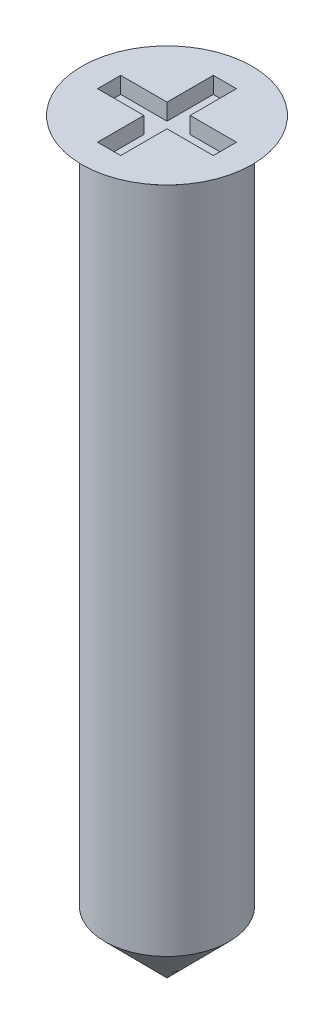
ISO-10303-21;
HEADER;
FILE_DESCRIPTION(('STEP AP214'),'2;1');
FILE_NAME('part.step','',(''),(''),'','','');
FILE_SCHEMA(('AUTOMOTIVE_DESIGN { 1 0 10303 214 1 1 1 1 }'));
ENDSEC;
DATA;
#1=APPLICATION_CONTEXT('core data for automotive mechanical design processes');
#2=APPLICATION_PROTOCOL_DEFINITION('international standard','automotive_design',2000,#1);
#3=PRODUCT_CONTEXT('',#1,'mechanical');
#4=PRODUCT('Part','Part','',(#3));
#5=PRODUCT_RELATED_PRODUCT_CATEGORY('part','',(#4));
#6=PRODUCT_DEFINITION_FORMATION('','',#4);
#7=PRODUCT_DEFINITION_CONTEXT('part definition',#1,'design');
#8=PRODUCT_DEFINITION('design','',#6,#7);
#9=PRODUCT_DEFINITION_SHAPE('','',#8);
#10=(LENGTH_UNIT() NAMED_UNIT(*) SI_UNIT(.MILLI.,.METRE.));
#11=(NAMED_UNIT(*) PLANE_ANGLE_UNIT() SI_UNIT($,.RADIAN.));
#12=(NAMED_UNIT(*) SI_UNIT($,.STERADIAN.) SOLID_ANGLE_UNIT());
#13=UNCERTAINTY_MEASURE_WITH_UNIT(LENGTH_MEASURE(1.E-05),#10,'distance_accuracy_value','');
#14=(GEOMETRIC_REPRESENTATION_CONTEXT(3) GLOBAL_UNCERTAINTY_ASSIGNED_CONTEXT((#13)) GLOBAL_UNIT_ASSIGNED_CONTEXT((#10,
#11,#12)) REPRESENTATION_CONTEXT('',''));
#15=CARTESIAN_POINT('',(0.,0.,0.));
#16=DIRECTION('',(0.,0.,1.));
#17=DIRECTION('',(1.,0.,0.));
#18=AXIS2_PLACEMENT_3D('',#15,#16,#17);
#19=CARTESIAN_POINT('',(1.03,9.03,0.));
#20=DIRECTION('',(0.,-1.,0.));
#21=DIRECTION('',(0.,0.,-1.));
#22=AXIS2_PLACEMENT_3D('',#19,#20,#21);
#23=PLANE('',#22);
#24=DIRECTION('',(0.,0.,1.));
#25=VECTOR('',#24,1.);
#26=CARTESIAN_POINT('',(-0.14,9.03,-0.14));
#27=LINE('',#26,#25);
#28=CARTESIAN_POINT('',(-0.14,9.03,-0.7));
#29=VERTEX_POINT('',#28);
#30=CARTESIAN_POINT('',(-0.14,9.03,-0.14));
#31=VERTEX_POINT('',#30);
#32=EDGE_CURVE('E196',#29,#31,#27,.T.);
#33=ORIENTED_EDGE('',*,*,#32,.F.);
#34=DIRECTION('',(-1.,0.,0.));
#35=VECTOR('',#34,1.);
#36=CARTESIAN_POINT('',(0.14,9.03,-0.7));
#37=LINE('',#36,#35);
#38=CARTESIAN_POINT('',(0.14,9.03,-0.7));
#39=VERTEX_POINT('',#38);
#40=EDGE_CURVE('E54',#39,#29,#37,.T.);
#41=ORIENTED_EDGE('',*,*,#40,.F.);
#42=DIRECTION('',(0.,0.,-1.));
#43=VECTOR('',#42,1.);
#44=CARTESIAN_POINT('',(0.14,9.03,-0.14));
#45=LINE('',#44,#43);
#46=CARTESIAN_POINT('',(0.14,9.03,-0.14));
#47=VERTEX_POINT('',#46);
#48=EDGE_CURVE('E152',#47,#39,#45,.T.);
#49=ORIENTED_EDGE('',*,*,#48,.F.);
#50=DIRECTION('',(-1.,0.,0.));
#51=VECTOR('',#50,1.);
#52=CARTESIAN_POINT('',(0.7,9.03,-0.14));
#53=LINE('',#52,#51);
#54=CARTESIAN_POINT('',(0.7,9.03,-0.14));
#55=VERTEX_POINT('',#54);
#56=EDGE_CURVE('E156',#55,#47,#53,.T.);
#57=ORIENTED_EDGE('',*,*,#56,.F.);
#58=DIRECTION('',(0.,0.,-1.));
#59=VECTOR('',#58,1.);
#60=CARTESIAN_POINT('',(0.7,9.03,0.14));
#61=LINE('',#60,#59);
#62=CARTESIAN_POINT('',(0.7,9.03,0.14));
#63=VERTEX_POINT('',#62);
#64=EDGE_CURVE('E227',#63,#55,#61,.T.);
#65=ORIENTED_EDGE('',*,*,#64,.F.);
#66=DIRECTION('',(1.,0.,0.));
#67=VECTOR('',#66,1.);
#68=CARTESIAN_POINT('',(0.7,9.03,0.14));
#69=LINE('',#68,#67);
#70=CARTESIAN_POINT('',(0.14,9.03,0.14));
#71=VERTEX_POINT('',#70);
#72=EDGE_CURVE('E223',#71,#63,#69,.T.);
#73=ORIENTED_EDGE('',*,*,#72,.F.);
#74=DIRECTION('',(0.,0.,-1.));
#75=VECTOR('',#74,1.);
#76=CARTESIAN_POINT('',(0.14,9.03,0.7));
#77=LINE('',#76,#75);
#78=CARTESIAN_POINT('',(0.14,9.03,0.7));
#79=VERTEX_POINT('',#78);
#80=EDGE_CURVE('E219',#79,#71,#77,.T.);
#81=ORIENTED_EDGE('',*,*,#80,.F.);
#82=DIRECTION('',(1.,0.,0.));
#83=VECTOR('',#82,1.);
#84=CARTESIAN_POINT('',(0.14,9.03,0.7));
#85=LINE('',#84,#83);
#86=CARTESIAN_POINT('',(-0.14,9.03,0.7));
#87=VERTEX_POINT('',#86);
#88=EDGE_CURVE('E215',#87,#79,#85,.T.);
#89=ORIENTED_EDGE('',*,*,#88,.F.);
#90=DIRECTION('',(0.,0.,1.));
#91=VECTOR('',#90,1.);
#92=CARTESIAN_POINT('',(-0.14,9.03,0.7));
#93=LINE('',#92,#91);
#94=CARTESIAN_POINT('',(-0.14,9.03,0.14));
#95=VERTEX_POINT('',#94);
#96=EDGE_CURVE('E211',#95,#87,#93,.T.);
#97=ORIENTED_EDGE('',*,*,#96,.F.);
#98=DIRECTION('',(1.,0.,0.));
#99=VECTOR('',#98,1.);
#100=CARTESIAN_POINT('',(-0.14,9.03,0.14));
#101=LINE('',#100,#99);
#102=CARTESIAN_POINT('',(-0.7,9.03,0.14));
#103=VERTEX_POINT('',#102);
#104=EDGE_CURVE('E207',#103,#95,#101,.T.);
#105=ORIENTED_EDGE('',*,*,#104,.F.);
#106=DIRECTION('',(0.,0.,1.));
#107=VECTOR('',#106,1.);
#108=CARTESIAN_POINT('',(-0.7,9.03,0.14));
#109=LINE('',#108,#107);
#110=CARTESIAN_POINT('',(-0.7,9.03,-0.14));
#111=VERTEX_POINT('',#110);
#112=EDGE_CURVE('E203',#111,#103,#109,.T.);
#113=ORIENTED_EDGE('',*,*,#112,.F.);
#114=DIRECTION('',(-1.,0.,0.));
#115=VECTOR('',#114,1.);
#116=CARTESIAN_POINT('',(-0.14,9.03,-0.14));
#117=LINE('',#116,#115);
#118=EDGE_CURVE('E199',#31,#111,#117,.T.);
#119=ORIENTED_EDGE('',*,*,#118,.F.);
#120=EDGE_LOOP('',(#33,#41,#49,#57,#65,#73,#81,#89,#97,#105,#113,#119));
#121=FACE_BOUND('',#120,.T.);
#122=CARTESIAN_POINT('',(0.,9.03,0.));
#123=DIRECTION('',(0.,1.,0.));
#124=DIRECTION('',(0.,0.,1.));
#125=AXIS2_PLACEMENT_3D('',#122,#123,#124);
#126=CIRCLE('',#125,1.03);
#127=CARTESIAN_POINT('',(0.,9.03,1.03));
#128=VERTEX_POINT('',#127);
#129=EDGE_CURVE('E11',#128,#128,#126,.T.);
#130=ORIENTED_EDGE('',*,*,#129,.T.);
#131=EDGE_LOOP('',(#130));
#132=FACE_BOUND('',#131,.T.);
#133=ADVANCED_FACE('F39',(#121,#132),#23,.F.);
#134=CARTESIAN_POINT('',(0.,8.83,0.));
#135=DIRECTION('',(0.,1.,0.));
#136=DIRECTION('',(0.,0.,1.));
#137=AXIS2_PLACEMENT_3D('',#134,#135,#136);
#138=CONICAL_SURFACE('',#137,0.75,0.950546840812074);
#139=ORIENTED_EDGE('',*,*,#129,.F.);
#140=EDGE_LOOP('',(#139));
#141=FACE_BOUND('',#140,.T.);
#142=CARTESIAN_POINT('',(0.,8.83,0.));
#143=DIRECTION('',(0.,1.,0.));
#144=DIRECTION('',(0.,0.,1.));
#145=AXIS2_PLACEMENT_3D('',#142,#143,#144);
#146=CIRCLE('',#145,0.75);
#147=CARTESIAN_POINT('',(0.,8.83,0.75));
#148=VERTEX_POINT('',#147);
#149=EDGE_CURVE('E47',#148,#148,#146,.T.);
#150=ORIENTED_EDGE('',*,*,#149,.T.);
#151=EDGE_LOOP('',(#150));
#152=FACE_BOUND('',#151,.T.);
#153=ADVANCED_FACE('F273',(#141,#152),#138,.T.);
#154=CARTESIAN_POINT('',(0.,12.9125486381323,0.));
#155=DIRECTION('',(0.,1.,0.));
#156=DIRECTION('',(0.,0.,1.));
#157=AXIS2_PLACEMENT_3D('',#154,#155,#156);
#158=CYLINDRICAL_SURFACE('',#157,0.75);
#159=ORIENTED_EDGE('',*,*,#149,.F.);
#160=EDGE_LOOP('',(#159));
#161=FACE_BOUND('',#160,.T.);
#162=CARTESIAN_POINT('',(0.,0.755428015564202,0.));
#163=DIRECTION('',(0.,1.,0.));
#164=DIRECTION('',(0.,0.,1.));
#165=AXIS2_PLACEMENT_3D('',#162,#163,#164);
#166=CIRCLE('',#165,0.75);
#167=CARTESIAN_POINT('',(0.,0.755428015564202,0.75));
#168=VERTEX_POINT('',#167);
#169=EDGE_CURVE('E237',#168,#168,#166,.T.);
#170=ORIENTED_EDGE('',*,*,#169,.T.);
#171=EDGE_LOOP('',(#170));
#172=FACE_BOUND('',#171,.T.);
#173=ADVANCED_FACE('F275',(#161,#172),#158,.T.);
#174=CARTESIAN_POINT('',(0.,0.,0.));
#175=DIRECTION('',(0.,1.,0.));
#176=DIRECTION('',(0.,0.,1.));
#177=AXIS2_PLACEMENT_3D('',#174,#175,#176);
#178=CONICAL_SURFACE('',#177,0.,0.781792549588056);
#179=ORIENTED_EDGE('',*,*,#169,.F.);
#180=EDGE_LOOP('',(#179));
#181=FACE_BOUND('',#180,.T.);
#182=CARTESIAN_POINT('',(0.,0.,0.));
#183=VERTEX_POINT('',#182);
#184=VERTEX_LOOP('',#183);
#185=FACE_BOUND('',#184,.T.);
#186=ADVANCED_FACE('F278',(#181,#185),#178,.T.);
#187=CARTESIAN_POINT('',(0.14,8.83,-0.7));
#188=DIRECTION('',(0.,0.,-1.));
#189=DIRECTION('',(-1.,0.,0.));
#190=AXIS2_PLACEMENT_3D('',#187,#188,#189);
#191=PLANE('',#190);
#192=ORIENTED_EDGE('',*,*,#40,.T.);
#193=DIRECTION('',(0.,1.,0.));
#194=VECTOR('',#193,1.);
#195=CARTESIAN_POINT('',(-0.14,8.83,-0.7));
#196=LINE('',#195,#194);
#197=CARTESIAN_POINT('',(-0.14,8.83,-0.7));
#198=VERTEX_POINT('',#197);
#199=EDGE_CURVE('E126',#198,#29,#196,.T.);
#200=ORIENTED_EDGE('',*,*,#199,.F.);
#201=DIRECTION('',(-1.,0.,0.));
#202=VECTOR('',#201,1.);
#203=CARTESIAN_POINT('',(0.14,8.83,-0.7));
#204=LINE('',#203,#202);
#205=CARTESIAN_POINT('',(0.14,8.83,-0.7));
#206=VERTEX_POINT('',#205);
#207=EDGE_CURVE('E130',#206,#198,#204,.T.);
#208=ORIENTED_EDGE('',*,*,#207,.F.);
#209=DIRECTION('',(0.,1.,0.));
#210=VECTOR('',#209,1.);
#211=CARTESIAN_POINT('',(0.14,8.83,-0.7));
#212=LINE('',#211,#210);
#213=EDGE_CURVE('E234',#206,#39,#212,.T.);
#214=ORIENTED_EDGE('',*,*,#213,.T.);
#215=EDGE_LOOP('',(#192,#200,#208,#214));
#216=FACE_BOUND('',#215,.T.);
#217=ADVANCED_FACE('F128',(#216),#191,.F.);
#218=CARTESIAN_POINT('',(0.14,8.83,-0.14));
#219=DIRECTION('',(1.,0.,0.));
#220=DIRECTION('',(0.,0.,-1.));
#221=AXIS2_PLACEMENT_3D('',#218,#219,#220);
#222=PLANE('',#221);
#223=ORIENTED_EDGE('',*,*,#48,.T.);
#224=ORIENTED_EDGE('',*,*,#213,.F.);
#225=DIRECTION('',(0.,0.,-1.));
#226=VECTOR('',#225,1.);
#227=CARTESIAN_POINT('',(0.14,8.83,-0.14));
#228=LINE('',#227,#226);
#229=CARTESIAN_POINT('',(0.14,8.83,-0.14));
#230=VERTEX_POINT('',#229);
#231=EDGE_CURVE('E137',#230,#206,#228,.T.);
#232=ORIENTED_EDGE('',*,*,#231,.F.);
#233=DIRECTION('',(0.,1.,0.));
#234=VECTOR('',#233,1.);
#235=CARTESIAN_POINT('',(0.14,8.83,-0.14));
#236=LINE('',#235,#234);
#237=EDGE_CURVE('E238',#230,#47,#236,.T.);
#238=ORIENTED_EDGE('',*,*,#237,.T.);
#239=EDGE_LOOP('',(#223,#224,#232,#238));
#240=FACE_BOUND('',#239,.T.);
#241=ADVANCED_FACE('F287',(#240),#222,.F.);
#242=CARTESIAN_POINT('',(0.7,8.83,-0.14));
#243=DIRECTION('',(0.,0.,-1.));
#244=DIRECTION('',(-1.,0.,0.));
#245=AXIS2_PLACEMENT_3D('',#242,#243,#244);
#246=PLANE('',#245);
#247=ORIENTED_EDGE('',*,*,#56,.T.);
#248=ORIENTED_EDGE('',*,*,#237,.F.);
#249=DIRECTION('',(-1.,0.,0.));
#250=VECTOR('',#249,1.);
#251=CARTESIAN_POINT('',(0.7,8.83,-0.14));
#252=LINE('',#251,#250);
#253=CARTESIAN_POINT('',(0.7,8.83,-0.14));
#254=VERTEX_POINT('',#253);
#255=EDGE_CURVE('E189',#254,#230,#252,.T.);
#256=ORIENTED_EDGE('',*,*,#255,.F.);
#257=DIRECTION('',(0.,1.,0.));
#258=VECTOR('',#257,1.);
#259=CARTESIAN_POINT('',(0.7,8.83,-0.14));
#260=LINE('',#259,#258);
#261=EDGE_CURVE('E241',#254,#55,#260,.T.);
#262=ORIENTED_EDGE('',*,*,#261,.T.);
#263=EDGE_LOOP('',(#247,#248,#256,#262));
#264=FACE_BOUND('',#263,.T.);
#265=ADVANCED_FACE('F332',(#264),#246,.F.);
#266=CARTESIAN_POINT('',(0.7,8.83,0.14));
#267=DIRECTION('',(1.,0.,0.));
#268=DIRECTION('',(0.,0.,-1.));
#269=AXIS2_PLACEMENT_3D('',#266,#267,#268);
#270=PLANE('',#269);
#271=ORIENTED_EDGE('',*,*,#64,.T.);
#272=ORIENTED_EDGE('',*,*,#261,.F.);
#273=DIRECTION('',(0.,0.,-1.));
#274=VECTOR('',#273,1.);
#275=CARTESIAN_POINT('',(0.7,8.83,0.14));
#276=LINE('',#275,#274);
#277=CARTESIAN_POINT('',(0.7,8.83,0.14));
#278=VERTEX_POINT('',#277);
#279=EDGE_CURVE('E185',#278,#254,#276,.T.);
#280=ORIENTED_EDGE('',*,*,#279,.F.);
#281=DIRECTION('',(0.,1.,0.));
#282=VECTOR('',#281,1.);
#283=CARTESIAN_POINT('',(0.7,8.83,0.14));
#284=LINE('',#283,#282);
#285=EDGE_CURVE('E244',#278,#63,#284,.T.);
#286=ORIENTED_EDGE('',*,*,#285,.T.);
#287=EDGE_LOOP('',(#271,#272,#280,#286));
#288=FACE_BOUND('',#287,.T.);
#289=ADVANCED_FACE('F328',(#288),#270,.F.);
#290=CARTESIAN_POINT('',(0.7,8.83,0.14));
#291=DIRECTION('',(0.,0.,1.));
#292=DIRECTION('',(1.,0.,0.));
#293=AXIS2_PLACEMENT_3D('',#290,#291,#292);
#294=PLANE('',#293);
#295=ORIENTED_EDGE('',*,*,#72,.T.);
#296=ORIENTED_EDGE('',*,*,#285,.F.);
#297=DIRECTION('',(1.,0.,0.));
#298=VECTOR('',#297,1.);
#299=CARTESIAN_POINT('',(0.7,8.83,0.14));
#300=LINE('',#299,#298);
#301=CARTESIAN_POINT('',(0.14,8.83,0.14));
#302=VERTEX_POINT('',#301);
#303=EDGE_CURVE('E181',#302,#278,#300,.T.);
#304=ORIENTED_EDGE('',*,*,#303,.F.);
#305=DIRECTION('',(0.,1.,0.));
#306=VECTOR('',#305,1.);
#307=CARTESIAN_POINT('',(0.14,8.83,0.14));
#308=LINE('',#307,#306);
#309=EDGE_CURVE('E247',#302,#71,#308,.T.);
#310=ORIENTED_EDGE('',*,*,#309,.T.);
#311=EDGE_LOOP('',(#295,#296,#304,#310));
#312=FACE_BOUND('',#311,.T.);
#313=ADVANCED_FACE('F324',(#312),#294,.F.);
#314=CARTESIAN_POINT('',(0.14,8.83,0.7));
#315=DIRECTION('',(1.,0.,0.));
#316=DIRECTION('',(0.,0.,-1.));
#317=AXIS2_PLACEMENT_3D('',#314,#315,#316);
#318=PLANE('',#317);
#319=ORIENTED_EDGE('',*,*,#80,.T.);
#320=ORIENTED_EDGE('',*,*,#309,.F.);
#321=DIRECTION('',(0.,0.,-1.));
#322=VECTOR('',#321,1.);
#323=CARTESIAN_POINT('',(0.14,8.83,0.7));
#324=LINE('',#323,#322);
#325=CARTESIAN_POINT('',(0.14,8.83,0.7));
#326=VERTEX_POINT('',#325);
#327=EDGE_CURVE('E177',#326,#302,#324,.T.);
#328=ORIENTED_EDGE('',*,*,#327,.F.);
#329=DIRECTION('',(0.,1.,0.));
#330=VECTOR('',#329,1.);
#331=CARTESIAN_POINT('',(0.14,8.83,0.7));
#332=LINE('',#331,#330);
#333=EDGE_CURVE('E250',#326,#79,#332,.T.);
#334=ORIENTED_EDGE('',*,*,#333,.T.);
#335=EDGE_LOOP('',(#319,#320,#328,#334));
#336=FACE_BOUND('',#335,.T.);
#337=ADVANCED_FACE('F320',(#336),#318,.F.);
#338=CARTESIAN_POINT('',(0.14,8.83,0.7));
#339=DIRECTION('',(0.,0.,1.));
#340=DIRECTION('',(1.,0.,0.));
#341=AXIS2_PLACEMENT_3D('',#338,#339,#340);
#342=PLANE('',#341);
#343=ORIENTED_EDGE('',*,*,#88,.T.);
#344=ORIENTED_EDGE('',*,*,#333,.F.);
#345=DIRECTION('',(1.,0.,0.));
#346=VECTOR('',#345,1.);
#347=CARTESIAN_POINT('',(0.14,8.83,0.7));
#348=LINE('',#347,#346);
#349=CARTESIAN_POINT('',(-0.14,8.83,0.7));
#350=VERTEX_POINT('',#349);
#351=EDGE_CURVE('E173',#350,#326,#348,.T.);
#352=ORIENTED_EDGE('',*,*,#351,.F.);
#353=DIRECTION('',(0.,1.,0.));
#354=VECTOR('',#353,1.);
#355=CARTESIAN_POINT('',(-0.14,8.83,0.7));
#356=LINE('',#355,#354);
#357=EDGE_CURVE('E253',#350,#87,#356,.T.);
#358=ORIENTED_EDGE('',*,*,#357,.T.);
#359=EDGE_LOOP('',(#343,#344,#352,#358));
#360=FACE_BOUND('',#359,.T.);
#361=ADVANCED_FACE('F316',(#360),#342,.F.);
#362=CARTESIAN_POINT('',(-0.14,8.83,0.7));
#363=DIRECTION('',(-1.,0.,0.));
#364=DIRECTION('',(0.,0.,1.));
#365=AXIS2_PLACEMENT_3D('',#362,#363,#364);
#366=PLANE('',#365);
#367=ORIENTED_EDGE('',*,*,#96,.T.);
#368=ORIENTED_EDGE('',*,*,#357,.F.);
#369=DIRECTION('',(0.,0.,1.));
#370=VECTOR('',#369,1.);
#371=CARTESIAN_POINT('',(-0.14,8.83,0.7));
#372=LINE('',#371,#370);
#373=CARTESIAN_POINT('',(-0.14,8.83,0.14));
#374=VERTEX_POINT('',#373);
#375=EDGE_CURVE('E169',#374,#350,#372,.T.);
#376=ORIENTED_EDGE('',*,*,#375,.F.);
#377=DIRECTION('',(0.,1.,0.));
#378=VECTOR('',#377,1.);
#379=CARTESIAN_POINT('',(-0.14,8.83,0.14));
#380=LINE('',#379,#378);
#381=EDGE_CURVE('E256',#374,#95,#380,.T.);
#382=ORIENTED_EDGE('',*,*,#381,.T.);
#383=EDGE_LOOP('',(#367,#368,#376,#382));
#384=FACE_BOUND('',#383,.T.);
#385=ADVANCED_FACE('F312',(#384),#366,.F.);
#386=CARTESIAN_POINT('',(-0.14,8.83,0.14));
#387=DIRECTION('',(0.,0.,1.));
#388=DIRECTION('',(1.,0.,0.));
#389=AXIS2_PLACEMENT_3D('',#386,#387,#388);
#390=PLANE('',#389);
#391=ORIENTED_EDGE('',*,*,#104,.T.);
#392=ORIENTED_EDGE('',*,*,#381,.F.);
#393=DIRECTION('',(1.,0.,0.));
#394=VECTOR('',#393,1.);
#395=CARTESIAN_POINT('',(-0.14,8.83,0.14));
#396=LINE('',#395,#394);
#397=CARTESIAN_POINT('',(-0.7,8.83,0.14));
#398=VERTEX_POINT('',#397);
#399=EDGE_CURVE('E165',#398,#374,#396,.T.);
#400=ORIENTED_EDGE('',*,*,#399,.F.);
#401=DIRECTION('',(0.,1.,0.));
#402=VECTOR('',#401,1.);
#403=CARTESIAN_POINT('',(-0.7,8.83,0.14));
#404=LINE('',#403,#402);
#405=EDGE_CURVE('E259',#398,#103,#404,.T.);
#406=ORIENTED_EDGE('',*,*,#405,.T.);
#407=EDGE_LOOP('',(#391,#392,#400,#406));
#408=FACE_BOUND('',#407,.T.);
#409=ADVANCED_FACE('F308',(#408),#390,.F.);
#410=CARTESIAN_POINT('',(-0.7,8.83,0.14));
#411=DIRECTION('',(-1.,0.,0.));
#412=DIRECTION('',(0.,0.,1.));
#413=AXIS2_PLACEMENT_3D('',#410,#411,#412);
#414=PLANE('',#413);
#415=ORIENTED_EDGE('',*,*,#112,.T.);
#416=ORIENTED_EDGE('',*,*,#405,.F.);
#417=DIRECTION('',(0.,0.,1.));
#418=VECTOR('',#417,1.);
#419=CARTESIAN_POINT('',(-0.7,8.83,0.14));
#420=LINE('',#419,#418);
#421=CARTESIAN_POINT('',(-0.7,8.83,-0.14));
#422=VERTEX_POINT('',#421);
#423=EDGE_CURVE('E161',#422,#398,#420,.T.);
#424=ORIENTED_EDGE('',*,*,#423,.F.);
#425=DIRECTION('',(0.,1.,0.));
#426=VECTOR('',#425,1.);
#427=CARTESIAN_POINT('',(-0.7,8.83,-0.14));
#428=LINE('',#427,#426);
#429=EDGE_CURVE('E262',#422,#111,#428,.T.);
#430=ORIENTED_EDGE('',*,*,#429,.T.);
#431=EDGE_LOOP('',(#415,#416,#424,#430));
#432=FACE_BOUND('',#431,.T.);
#433=ADVANCED_FACE('F306',(#432),#414,.F.);
#434=CARTESIAN_POINT('',(-0.14,8.83,-0.14));
#435=DIRECTION('',(0.,0.,-1.));
#436=DIRECTION('',(-1.,0.,0.));
#437=AXIS2_PLACEMENT_3D('',#434,#435,#436);
#438=PLANE('',#437);
#439=ORIENTED_EDGE('',*,*,#118,.T.);
#440=ORIENTED_EDGE('',*,*,#429,.F.);
#441=DIRECTION('',(-1.,0.,0.));
#442=VECTOR('',#441,1.);
#443=CARTESIAN_POINT('',(-0.14,8.83,-0.14));
#444=LINE('',#443,#442);
#445=CARTESIAN_POINT('',(-0.14,8.83,-0.14));
#446=VERTEX_POINT('',#445);
#447=EDGE_CURVE('E146',#446,#422,#444,.T.);
#448=ORIENTED_EDGE('',*,*,#447,.F.);
#449=DIRECTION('',(0.,1.,0.));
#450=VECTOR('',#449,1.);
#451=CARTESIAN_POINT('',(-0.14,8.83,-0.14));
#452=LINE('',#451,#450);
#453=EDGE_CURVE('E136',#446,#31,#452,.T.);
#454=ORIENTED_EDGE('',*,*,#453,.T.);
#455=EDGE_LOOP('',(#439,#440,#448,#454));
#456=FACE_BOUND('',#455,.T.);
#457=ADVANCED_FACE('F302',(#456),#438,.F.);
#458=CARTESIAN_POINT('',(-0.14,8.83,-0.14));
#459=DIRECTION('',(-1.,0.,0.));
#460=DIRECTION('',(0.,0.,1.));
#461=AXIS2_PLACEMENT_3D('',#458,#459,#460);
#462=PLANE('',#461);
#463=ORIENTED_EDGE('',*,*,#32,.T.);
#464=ORIENTED_EDGE('',*,*,#453,.F.);
#465=DIRECTION('',(0.,0.,1.));
#466=VECTOR('',#465,1.);
#467=CARTESIAN_POINT('',(-0.14,8.83,-0.14));
#468=LINE('',#467,#466);
#469=EDGE_CURVE('E140',#198,#446,#468,.T.);
#470=ORIENTED_EDGE('',*,*,#469,.F.);
#471=ORIENTED_EDGE('',*,*,#199,.T.);
#472=EDGE_LOOP('',(#463,#464,#470,#471));
#473=FACE_BOUND('',#472,.T.);
#474=ADVANCED_FACE('F141',(#473),#462,.F.);
#475=CARTESIAN_POINT('',(0.,8.83,0.));
#476=DIRECTION('',(0.,-1.,0.));
#477=DIRECTION('',(0.,0.,-1.));
#478=AXIS2_PLACEMENT_3D('',#475,#476,#477);
#479=PLANE('',#478);
#480=ORIENTED_EDGE('',*,*,#207,.T.);
#481=ORIENTED_EDGE('',*,*,#469,.T.);
#482=ORIENTED_EDGE('',*,*,#447,.T.);
#483=ORIENTED_EDGE('',*,*,#423,.T.);
#484=ORIENTED_EDGE('',*,*,#399,.T.);
#485=ORIENTED_EDGE('',*,*,#375,.T.);
#486=ORIENTED_EDGE('',*,*,#351,.T.);
#487=ORIENTED_EDGE('',*,*,#327,.T.);
#488=ORIENTED_EDGE('',*,*,#303,.T.);
#489=ORIENTED_EDGE('',*,*,#279,.T.);
#490=ORIENTED_EDGE('',*,*,#255,.T.);
#491=ORIENTED_EDGE('',*,*,#231,.T.);
#492=EDGE_LOOP('',(#480,#481,#482,#483,#484,#485,#486,#487,#488,#489,#490,#491));
#493=FACE_BOUND('',#492,.T.);
#494=ADVANCED_FACE('F148',(#493),#479,.F.);
#495=CLOSED_SHELL('',(#133,#153,#173,#186,#217,#241,#265,#289,#313,#337,#361,#385,#409,#433,
#457,#474,#494));
#496=MANIFOLD_SOLID_BREP('B2',#495);
#497=ADVANCED_BREP_SHAPE_REPRESENTATION('',(#18,#496),#14);
#498=SHAPE_DEFINITION_REPRESENTATION(#9,#497);
ENDSEC;
END-ISO-10303-21;
